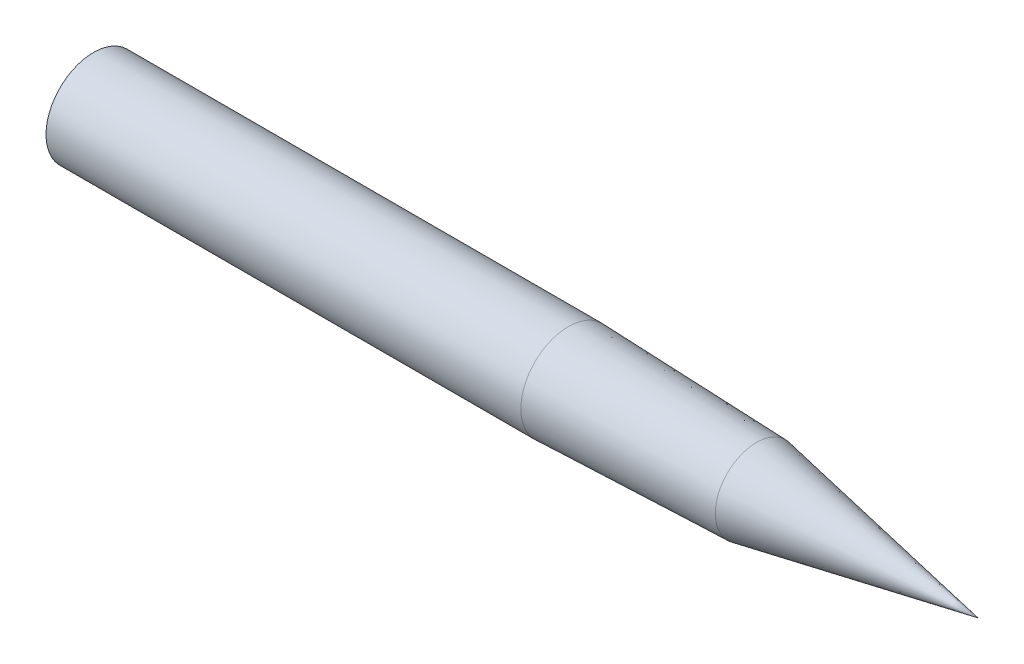
ISO-10303-21;
HEADER;
FILE_DESCRIPTION(('STEP AP214'),'2;1');
FILE_NAME('part.step','',(''),(''),'','','');
FILE_SCHEMA(('AUTOMOTIVE_DESIGN { 1 0 10303 214 1 1 1 1 }'));
ENDSEC;
DATA;
#1=APPLICATION_CONTEXT('core data for automotive mechanical design processes');
#2=APPLICATION_PROTOCOL_DEFINITION('international standard','automotive_design',2000,#1);
#3=PRODUCT_CONTEXT('',#1,'mechanical');
#4=PRODUCT('Part','Part','',(#3));
#5=PRODUCT_RELATED_PRODUCT_CATEGORY('part','',(#4));
#6=PRODUCT_DEFINITION_FORMATION('','',#4);
#7=PRODUCT_DEFINITION_CONTEXT('part definition',#1,'design');
#8=PRODUCT_DEFINITION('design','',#6,#7);
#9=PRODUCT_DEFINITION_SHAPE('','',#8);
#10=(LENGTH_UNIT() NAMED_UNIT(*) SI_UNIT(.MILLI.,.METRE.));
#11=(NAMED_UNIT(*) PLANE_ANGLE_UNIT() SI_UNIT($,.RADIAN.));
#12=(NAMED_UNIT(*) SI_UNIT($,.STERADIAN.) SOLID_ANGLE_UNIT());
#13=UNCERTAINTY_MEASURE_WITH_UNIT(LENGTH_MEASURE(1.E-05),#10,'distance_accuracy_value','');
#14=(GEOMETRIC_REPRESENTATION_CONTEXT(3) GLOBAL_UNCERTAINTY_ASSIGNED_CONTEXT((#13)) GLOBAL_UNIT_ASSIGNED_CONTEXT((#10,
#11,#12)) REPRESENTATION_CONTEXT('',''));
#15=CARTESIAN_POINT('',(0.,0.,0.));
#16=DIRECTION('',(0.,0.,1.));
#17=DIRECTION('',(1.,0.,0.));
#18=AXIS2_PLACEMENT_3D('',#15,#16,#17);
#19=CARTESIAN_POINT('',(0.,1.5,0.));
#20=DIRECTION('',(1.,0.,0.));
#21=DIRECTION('',(0.,0.,-1.));
#22=AXIS2_PLACEMENT_3D('',#19,#20,#21);
#23=PLANE('',#22);
#24=CARTESIAN_POINT('',(0.,0.,0.));
#25=DIRECTION('',(-1.,0.,0.));
#26=DIRECTION('',(0.,0.,1.));
#27=AXIS2_PLACEMENT_3D('',#24,#25,#26);
#28=CIRCLE('',#27,1.5);
#29=CARTESIAN_POINT('',(0.,0.,1.5));
#30=VERTEX_POINT('',#29);
#31=EDGE_CURVE('E63',#30,#30,#28,.T.);
#32=ORIENTED_EDGE('',*,*,#31,.T.);
#33=EDGE_LOOP('',(#32));
#34=FACE_BOUND('',#33,.T.);
#35=ADVANCED_FACE('F33',(#34),#23,.F.);
#36=CARTESIAN_POINT('',(27.9391187544915,0.,0.));
#37=DIRECTION('',(-1.,0.,0.));
#38=DIRECTION('',(0.,0.,1.));
#39=AXIS2_PLACEMENT_3D('',#36,#37,#38);
#40=CONICAL_SURFACE('',#39,0.,0.18362232616928);
#41=CARTESIAN_POINT('',(20.9391187544915,0.,0.));
#42=DIRECTION('',(-1.,0.,0.));
#43=DIRECTION('',(0.,0.,1.));
#44=AXIS2_PLACEMENT_3D('',#41,#42,#43);
#45=CIRCLE('',#44,1.3);
#46=CARTESIAN_POINT('',(20.9391187544915,0.,1.3));
#47=VERTEX_POINT('',#46);
#48=EDGE_CURVE('E11',#47,#47,#45,.T.);
#49=ORIENTED_EDGE('',*,*,#48,.F.);
#50=EDGE_LOOP('',(#49));
#51=FACE_BOUND('',#50,.T.);
#52=CARTESIAN_POINT('',(27.9391187544915,0.,0.));
#53=VERTEX_POINT('',#52);
#54=VERTEX_LOOP('',#53);
#55=FACE_BOUND('',#54,.T.);
#56=ADVANCED_FACE('F42',(#51,#55),#40,.T.);
#57=CARTESIAN_POINT('',(20.9391187544915,0.,0.));
#58=DIRECTION('',(-1.,0.,0.));
#59=DIRECTION('',(0.,0.,1.));
#60=AXIS2_PLACEMENT_3D('',#57,#58,#59);
#61=CONICAL_SURFACE('',#60,1.3,0.0336623090316383);
#62=CARTESIAN_POINT('',(15.,0.,0.));
#63=DIRECTION('',(-1.,0.,0.));
#64=DIRECTION('',(0.,0.,1.));
#65=AXIS2_PLACEMENT_3D('',#62,#63,#64);
#66=CIRCLE('',#65,1.5);
#67=CARTESIAN_POINT('',(15.,0.,1.5));
#68=VERTEX_POINT('',#67);
#69=EDGE_CURVE('E39',#68,#68,#66,.T.);
#70=ORIENTED_EDGE('',*,*,#69,.F.);
#71=EDGE_LOOP('',(#70));
#72=FACE_BOUND('',#71,.T.);
#73=ORIENTED_EDGE('',*,*,#48,.T.);
#74=EDGE_LOOP('',(#73));
#75=FACE_BOUND('',#74,.T.);
#76=ADVANCED_FACE('F44',(#72,#75),#61,.T.);
#77=CARTESIAN_POINT('',(0.,0.,0.));
#78=DIRECTION('',(-1.,0.,0.));
#79=DIRECTION('',(0.,0.,1.));
#80=AXIS2_PLACEMENT_3D('',#77,#78,#79);
#81=CYLINDRICAL_SURFACE('',#80,1.5);
#82=ORIENTED_EDGE('',*,*,#31,.F.);
#83=EDGE_LOOP('',(#82));
#84=FACE_BOUND('',#83,.T.);
#85=ORIENTED_EDGE('',*,*,#69,.T.);
#86=EDGE_LOOP('',(#85));
#87=FACE_BOUND('',#86,.T.);
#88=ADVANCED_FACE('F50',(#84,#87),#81,.T.);
#89=CLOSED_SHELL('',(#35,#56,#76,#88));
#90=MANIFOLD_SOLID_BREP('B2',#89);
#91=ADVANCED_BREP_SHAPE_REPRESENTATION('',(#18,#90),#14);
#92=SHAPE_DEFINITION_REPRESENTATION(#9,#91);
ENDSEC;
END-ISO-10303-21;
